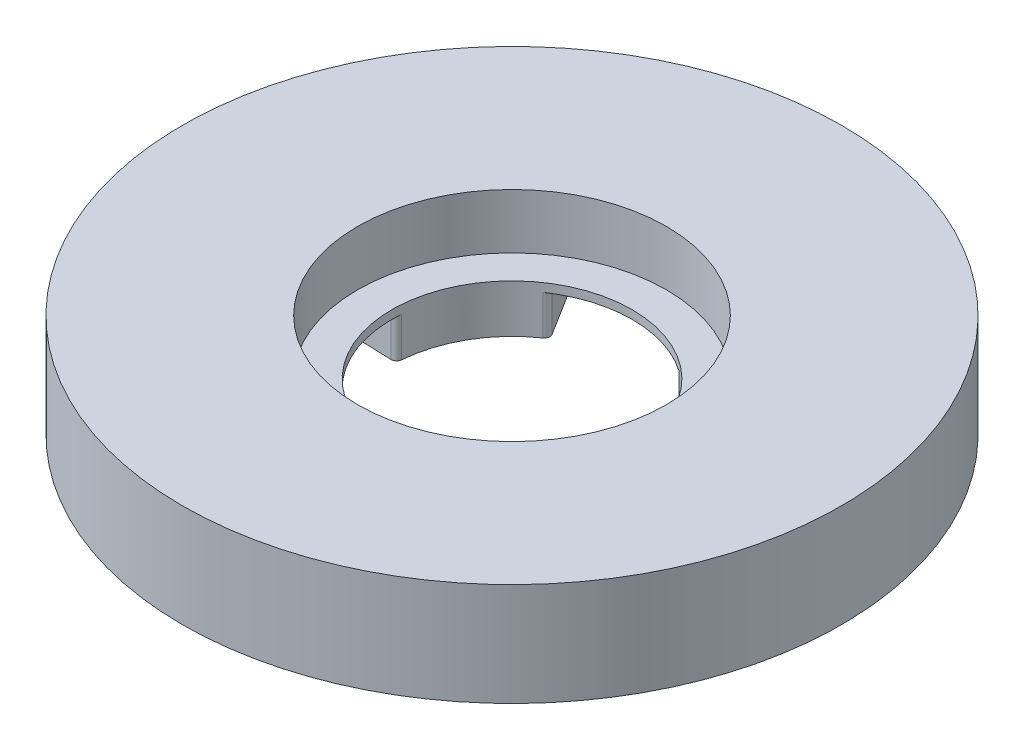
ISO-10303-21;
HEADER;
FILE_DESCRIPTION(('STEP AP214'),'2;1');
FILE_NAME('part.step','',(''),(''),'','','');
FILE_SCHEMA(('AUTOMOTIVE_DESIGN { 1 0 10303 214 1 1 1 1 }'));
ENDSEC;
DATA;
#1=APPLICATION_CONTEXT('core data for automotive mechanical design processes');
#2=APPLICATION_PROTOCOL_DEFINITION('international standard','automotive_design',2000,#1);
#3=PRODUCT_CONTEXT('',#1,'mechanical');
#4=PRODUCT('Part','Part','',(#3));
#5=PRODUCT_RELATED_PRODUCT_CATEGORY('part','',(#4));
#6=PRODUCT_DEFINITION_FORMATION('','',#4);
#7=PRODUCT_DEFINITION_CONTEXT('part definition',#1,'design');
#8=PRODUCT_DEFINITION('design','',#6,#7);
#9=PRODUCT_DEFINITION_SHAPE('','',#8);
#10=(LENGTH_UNIT() NAMED_UNIT(*) SI_UNIT(.MILLI.,.METRE.));
#11=(NAMED_UNIT(*) PLANE_ANGLE_UNIT() SI_UNIT($,.RADIAN.));
#12=(NAMED_UNIT(*) SI_UNIT($,.STERADIAN.) SOLID_ANGLE_UNIT());
#13=UNCERTAINTY_MEASURE_WITH_UNIT(LENGTH_MEASURE(1.E-05),#10,'distance_accuracy_value','');
#14=(GEOMETRIC_REPRESENTATION_CONTEXT(3) GLOBAL_UNCERTAINTY_ASSIGNED_CONTEXT((#13)) GLOBAL_UNIT_ASSIGNED_CONTEXT((#10,
#11,#12)) REPRESENTATION_CONTEXT('',''));
#15=CARTESIAN_POINT('',(0.,0.,0.));
#16=DIRECTION('',(0.,0.,1.));
#17=DIRECTION('',(1.,0.,0.));
#18=AXIS2_PLACEMENT_3D('',#15,#16,#17);
#19=CARTESIAN_POINT('',(-17.236281767268,-9.525,-1.11021387099341));
#20=DIRECTION('',(0.,-1.,0.));
#21=DIRECTION('',(0.,0.,-1.));
#22=AXIS2_PLACEMENT_3D('',#19,#20,#21);
#23=CYLINDRICAL_SURFACE('',#22,0.508);
#24=CARTESIAN_POINT('',(-17.236281767268,-5.8674,-1.11021387099341));
#25=DIRECTION('',(0.,-1.,0.));
#26=DIRECTION('',(0.,0.,-1.));
#27=AXIS2_PLACEMENT_3D('',#24,#25,#26);
#28=CIRCLE('',#27,0.508);
#29=CARTESIAN_POINT('',(-17.2540107115929,-5.8674,-0.602523330867708));
#30=VERTEX_POINT('',#29);
#31=CARTESIAN_POINT('',(-17.7432312310112,-5.8674,-1.1428672201403));
#32=VERTEX_POINT('',#31);
#33=EDGE_CURVE('E168',#30,#32,#28,.T.);
#34=ORIENTED_EDGE('',*,*,#33,.T.);
#35=DIRECTION('',(0.,-1.,0.));
#36=VECTOR('',#35,1.);
#37=CARTESIAN_POINT('',(-17.7432312310112,-9.525,-1.14286722014029));
#38=LINE('',#37,#36);
#39=CARTESIAN_POINT('',(-17.7432312310112,-9.525,-1.1428672201403));
#40=VERTEX_POINT('',#39);
#41=EDGE_CURVE('E166',#40,#32,#38,.F.);
#42=ORIENTED_EDGE('',*,*,#41,.F.);
#43=CARTESIAN_POINT('',(-17.236281767268,-9.525,-1.11021387099341));
#44=DIRECTION('',(0.,-1.,0.));
#45=DIRECTION('',(0.,0.,-1.));
#46=AXIS2_PLACEMENT_3D('',#43,#44,#45);
#47=CIRCLE('',#46,0.508);
#48=CARTESIAN_POINT('',(-17.2540107115929,-9.525,-0.602523330867708));
#49=VERTEX_POINT('',#48);
#50=EDGE_CURVE('E20',#40,#49,#47,.F.);
#51=ORIENTED_EDGE('',*,*,#50,.T.);
#52=DIRECTION('',(0.,1.,0.));
#53=VECTOR('',#52,1.);
#54=CARTESIAN_POINT('',(-17.2540107115929,-9.525,-0.602523330867708));
#55=LINE('',#54,#53);
#56=EDGE_CURVE('E163',#30,#49,#55,.F.);
#57=ORIENTED_EDGE('',*,*,#56,.F.);
#58=EDGE_LOOP('',(#34,#42,#51,#57));
#59=FACE_BOUND('',#58,.T.);
#60=ADVANCED_FACE('F17',(#59),#23,.T.);
#61=CARTESIAN_POINT('',(-9.5796142995477,-9.525,-14.3719509417433));
#62=DIRECTION('',(0.,-1.,0.));
#63=DIRECTION('',(0.,0.,-1.));
#64=AXIS2_PLACEMENT_3D('',#61,#62,#63);
#65=CYLINDRICAL_SURFACE('',#64,0.508);
#66=CARTESIAN_POINT('',(-9.5796142995477,-5.8674,-14.3719509417433));
#67=DIRECTION('',(0.,-1.,0.));
#68=DIRECTION('',(0.,0.,-1.));
#69=AXIS2_PLACEMENT_3D('',#66,#67,#68);
#70=CIRCLE('',#69,0.508);
#71=CARTESIAN_POINT('',(-9.86136766129909,-5.8674,-14.7946553812064));
#72=VERTEX_POINT('',#71);
#73=CARTESIAN_POINT('',(-9.14880586670024,-5.8674,-14.6411499279738));
#74=VERTEX_POINT('',#73);
#75=EDGE_CURVE('E359',#72,#74,#70,.T.);
#76=ORIENTED_EDGE('',*,*,#75,.T.);
#77=DIRECTION('',(0.,1.,0.));
#78=VECTOR('',#77,1.);
#79=CARTESIAN_POINT('',(-9.14880586670027,-9.525,-14.6411499279738));
#80=LINE('',#79,#78);
#81=CARTESIAN_POINT('',(-9.14880586670024,-9.525,-14.6411499279738));
#82=VERTEX_POINT('',#81);
#83=EDGE_CURVE('E258',#82,#74,#80,.T.);
#84=ORIENTED_EDGE('',*,*,#83,.F.);
#85=CARTESIAN_POINT('',(-9.5796142995477,-9.525,-14.3719509417433));
#86=DIRECTION('',(0.,-1.,0.));
#87=DIRECTION('',(0.,0.,-1.));
#88=AXIS2_PLACEMENT_3D('',#85,#86,#87);
#89=CIRCLE('',#88,0.508);
#90=CARTESIAN_POINT('',(-9.86136766129909,-9.525,-14.7946553812064));
#91=VERTEX_POINT('',#90);
#92=EDGE_CURVE('E361',#82,#91,#89,.F.);
#93=ORIENTED_EDGE('',*,*,#92,.T.);
#94=DIRECTION('',(0.,-1.,0.));
#95=VECTOR('',#94,1.);
#96=CARTESIAN_POINT('',(-9.86136766129908,-9.525,-14.7946553812064));
#97=LINE('',#96,#95);
#98=EDGE_CURVE('E175',#72,#91,#97,.T.);
#99=ORIENTED_EDGE('',*,*,#98,.F.);
#100=EDGE_LOOP('',(#76,#84,#93,#99));
#101=FACE_BOUND('',#100,.T.);
#102=ADVANCED_FACE('F374',(#101),#65,.T.);
#103=CARTESIAN_POINT('',(9.57961429954766,-9.525,-14.3719509417432));
#104=DIRECTION('',(0.,-1.,0.));
#105=DIRECTION('',(0.,0.,-1.));
#106=AXIS2_PLACEMENT_3D('',#103,#104,#105);
#107=CYLINDRICAL_SURFACE('',#106,0.508);
#108=CARTESIAN_POINT('',(9.57961429954766,-5.8674,-14.3719509417432));
#109=DIRECTION('',(0.,-1.,0.));
#110=DIRECTION('',(0.,0.,-1.));
#111=AXIS2_PLACEMENT_3D('',#108,#109,#110);
#112=CIRCLE('',#111,0.508);
#113=CARTESIAN_POINT('',(9.1488058667002,-5.8674,-14.6411499279736));
#114=VERTEX_POINT('',#113);
#115=CARTESIAN_POINT('',(9.86136766129907,-5.8674,-14.7946553812062));
#116=VERTEX_POINT('',#115);
#117=EDGE_CURVE('E355',#114,#116,#112,.T.);
#118=ORIENTED_EDGE('',*,*,#117,.T.);
#119=DIRECTION('',(0.,-1.,0.));
#120=VECTOR('',#119,1.);
#121=CARTESIAN_POINT('',(9.86136766129907,-9.525,-14.7946553812062));
#122=LINE('',#121,#120);
#123=CARTESIAN_POINT('',(9.86136766129907,-9.525,-14.7946553812062));
#124=VERTEX_POINT('',#123);
#125=EDGE_CURVE('E249',#124,#116,#122,.F.);
#126=ORIENTED_EDGE('',*,*,#125,.F.);
#127=CARTESIAN_POINT('',(9.57961429954766,-9.525,-14.3719509417432));
#128=DIRECTION('',(0.,-1.,0.));
#129=DIRECTION('',(0.,0.,-1.));
#130=AXIS2_PLACEMENT_3D('',#127,#128,#129);
#131=CIRCLE('',#130,0.508);
#132=CARTESIAN_POINT('',(9.1488058667002,-9.525,-14.6411499279736));
#133=VERTEX_POINT('',#132);
#134=EDGE_CURVE('E357',#124,#133,#131,.F.);
#135=ORIENTED_EDGE('',*,*,#134,.T.);
#136=DIRECTION('',(0.,1.,0.));
#137=VECTOR('',#136,1.);
#138=CARTESIAN_POINT('',(9.14880586670018,-9.525,-14.6411499279736));
#139=LINE('',#138,#137);
#140=EDGE_CURVE('E255',#114,#133,#139,.F.);
#141=ORIENTED_EDGE('',*,*,#140,.F.);
#142=EDGE_LOOP('',(#118,#126,#135,#141));
#143=FACE_BOUND('',#142,.T.);
#144=ADVANCED_FACE('F651',(#143),#107,.T.);
#145=CARTESIAN_POINT('',(17.2362817672678,-9.525,-1.11021387099337));
#146=DIRECTION('',(0.,-1.,0.));
#147=DIRECTION('',(0.,0.,-1.));
#148=AXIS2_PLACEMENT_3D('',#145,#146,#147);
#149=CYLINDRICAL_SURFACE('',#148,0.508);
#150=CARTESIAN_POINT('',(17.2362817672678,-5.8674,-1.11021387099337));
#151=DIRECTION('',(0.,-1.,0.));
#152=DIRECTION('',(0.,0.,-1.));
#153=AXIS2_PLACEMENT_3D('',#150,#151,#152);
#154=CIRCLE('',#153,0.508);
#155=CARTESIAN_POINT('',(17.743231231011,-5.8674,-1.14286722014026));
#156=VERTEX_POINT('',#155);
#157=CARTESIAN_POINT('',(17.2540107115926,-5.8674,-0.602523330867671));
#158=VERTEX_POINT('',#157);
#159=EDGE_CURVE('E351',#156,#158,#154,.T.);
#160=ORIENTED_EDGE('',*,*,#159,.T.);
#161=DIRECTION('',(0.,1.,0.));
#162=VECTOR('',#161,1.);
#163=CARTESIAN_POINT('',(17.2540107115926,-9.525,-0.602523330867669));
#164=LINE('',#163,#162);
#165=CARTESIAN_POINT('',(17.2540107115926,-9.525,-0.602523330867671));
#166=VERTEX_POINT('',#165);
#167=EDGE_CURVE('E241',#166,#158,#164,.T.);
#168=ORIENTED_EDGE('',*,*,#167,.F.);
#169=CARTESIAN_POINT('',(17.2362817672678,-9.525,-1.11021387099337));
#170=DIRECTION('',(0.,-1.,0.));
#171=DIRECTION('',(0.,0.,-1.));
#172=AXIS2_PLACEMENT_3D('',#169,#170,#171);
#173=CIRCLE('',#172,0.508);
#174=CARTESIAN_POINT('',(17.743231231011,-9.525,-1.14286722014026));
#175=VERTEX_POINT('',#174);
#176=EDGE_CURVE('E353',#166,#175,#173,.F.);
#177=ORIENTED_EDGE('',*,*,#176,.T.);
#178=DIRECTION('',(0.,-1.,0.));
#179=VECTOR('',#178,1.);
#180=CARTESIAN_POINT('',(17.743231231011,-9.525,-1.14286722014026));
#181=LINE('',#180,#179);
#182=EDGE_CURVE('E252',#156,#175,#181,.T.);
#183=ORIENTED_EDGE('',*,*,#182,.F.);
#184=EDGE_LOOP('',(#160,#168,#177,#183));
#185=FACE_BOUND('',#184,.T.);
#186=ADVANCED_FACE('F643',(#185),#149,.T.);
#187=CARTESIAN_POINT('',(7.65666746772007,-9.525,15.4821648127381));
#188=DIRECTION('',(0.,-1.,0.));
#189=DIRECTION('',(0.,0.,-1.));
#190=AXIS2_PLACEMENT_3D('',#187,#188,#189);
#191=CYLINDRICAL_SURFACE('',#190,0.508);
#192=CARTESIAN_POINT('',(7.65666746772007,-5.8674,15.4821648127381));
#193=DIRECTION('',(0.,-1.,0.));
#194=DIRECTION('',(0.,0.,-1.));
#195=AXIS2_PLACEMENT_3D('',#192,#193,#194);
#196=CIRCLE('',#195,0.508);
#197=CARTESIAN_POINT('',(8.10520484489241,-5.8674,15.2436732588428));
#198=VERTEX_POINT('',#197);
#199=CARTESIAN_POINT('',(7.88186356971184,-5.8674,15.937522601348));
#200=VERTEX_POINT('',#199);
#201=EDGE_CURVE('E347',#198,#200,#196,.T.);
#202=ORIENTED_EDGE('',*,*,#201,.T.);
#203=DIRECTION('',(0.,-1.,0.));
#204=VECTOR('',#203,1.);
#205=CARTESIAN_POINT('',(7.88186356971184,-9.525,15.937522601348));
#206=LINE('',#205,#204);
#207=CARTESIAN_POINT('',(7.88186356971184,-9.525,15.937522601348));
#208=VERTEX_POINT('',#207);
#209=EDGE_CURVE('E232',#208,#200,#206,.F.);
#210=ORIENTED_EDGE('',*,*,#209,.F.);
#211=CARTESIAN_POINT('',(7.65666746772007,-9.525,15.4821648127381));
#212=DIRECTION('',(0.,-1.,0.));
#213=DIRECTION('',(0.,0.,-1.));
#214=AXIS2_PLACEMENT_3D('',#211,#212,#213);
#215=CIRCLE('',#214,0.508);
#216=CARTESIAN_POINT('',(8.10520484489241,-9.525,15.2436732588428));
#217=VERTEX_POINT('',#216);
#218=EDGE_CURVE('E349',#208,#217,#215,.F.);
#219=ORIENTED_EDGE('',*,*,#218,.T.);
#220=DIRECTION('',(0.,1.,0.));
#221=VECTOR('',#220,1.);
#222=CARTESIAN_POINT('',(8.10520484489238,-9.525,15.2436732588428));
#223=LINE('',#222,#221);
#224=EDGE_CURVE('E238',#198,#217,#223,.F.);
#225=ORIENTED_EDGE('',*,*,#224,.F.);
#226=EDGE_LOOP('',(#202,#210,#219,#225));
#227=FACE_BOUND('',#226,.T.);
#228=ADVANCED_FACE('F635',(#227),#191,.T.);
#229=CARTESIAN_POINT('',(-7.65666746772029,-9.525,15.4821648127381));
#230=DIRECTION('',(0.,-1.,0.));
#231=DIRECTION('',(0.,0.,-1.));
#232=AXIS2_PLACEMENT_3D('',#229,#230,#231);
#233=CYLINDRICAL_SURFACE('',#232,0.508);
#234=CARTESIAN_POINT('',(-7.65666746772029,-5.8674,15.4821648127381));
#235=DIRECTION('',(0.,-1.,0.));
#236=DIRECTION('',(0.,0.,-1.));
#237=AXIS2_PLACEMENT_3D('',#234,#235,#236);
#238=CIRCLE('',#237,0.508);
#239=CARTESIAN_POINT('',(-7.88186356971205,-5.8674,15.937522601348));
#240=VERTEX_POINT('',#239);
#241=CARTESIAN_POINT('',(-8.10520484489262,-5.8674,15.2436732588428));
#242=VERTEX_POINT('',#241);
#243=EDGE_CURVE('E176',#240,#242,#238,.T.);
#244=ORIENTED_EDGE('',*,*,#243,.T.);
#245=DIRECTION('',(0.,1.,0.));
#246=VECTOR('',#245,1.);
#247=CARTESIAN_POINT('',(-8.10520484489259,-9.525,15.2436732588428));
#248=LINE('',#247,#246);
#249=CARTESIAN_POINT('',(-8.10520484489262,-9.525,15.2436732588428));
#250=VERTEX_POINT('',#249);
#251=EDGE_CURVE('E229',#250,#242,#248,.T.);
#252=ORIENTED_EDGE('',*,*,#251,.F.);
#253=CARTESIAN_POINT('',(-7.65666746772029,-9.525,15.4821648127381));
#254=DIRECTION('',(0.,-1.,0.));
#255=DIRECTION('',(0.,0.,-1.));
#256=AXIS2_PLACEMENT_3D('',#253,#254,#255);
#257=CIRCLE('',#256,0.508);
#258=CARTESIAN_POINT('',(-7.88186356971205,-9.525,15.937522601348));
#259=VERTEX_POINT('',#258);
#260=EDGE_CURVE('E345',#250,#259,#257,.F.);
#261=ORIENTED_EDGE('',*,*,#260,.T.);
#262=DIRECTION('',(0.,-1.,0.));
#263=VECTOR('',#262,1.);
#264=CARTESIAN_POINT('',(-7.88186356971205,-9.525,15.937522601348));
#265=LINE('',#264,#263);
#266=EDGE_CURVE('E235',#240,#259,#265,.T.);
#267=ORIENTED_EDGE('',*,*,#266,.F.);
#268=EDGE_LOOP('',(#244,#252,#261,#267));
#269=FACE_BOUND('',#268,.T.);
#270=ADVANCED_FACE('F628',(#269),#233,.T.);
#271=CARTESIAN_POINT('',(-4.06237350715329,-9.525,-0.141861208832689));
#272=DIRECTION('',(-0.0348994967025025,0.,0.999390827019096));
#273=DIRECTION('',(0.999390827019096,0.,0.0348994967025025));
#274=AXIS2_PLACEMENT_3D('',#271,#272,#273);
#275=PLANE('',#274);
#276=DIRECTION('',(-0.999390827019096,0.,-0.0348994967025026));
#277=VECTOR('',#276,1.);
#278=CARTESIAN_POINT('',(-11.6023187374872,-5.8674,-0.405161898201593));
#279=LINE('',#278,#277);
#280=CARTESIAN_POINT('',(-11.6023187374872,-5.8674,-0.405161898201593));
#281=VERTEX_POINT('',#280);
#282=EDGE_CURVE('E174',#281,#30,#279,.T.);
#283=ORIENTED_EDGE('',*,*,#282,.T.);
#284=ORIENTED_EDGE('',*,*,#56,.T.);
#285=DIRECTION('',(-0.999390827019096,0.,-0.0348994967025026));
#286=VECTOR('',#285,1.);
#287=CARTESIAN_POINT('',(-11.6023187374872,-9.525,-0.405161898201593));
#288=LINE('',#287,#286);
#289=CARTESIAN_POINT('',(-11.6023187374872,-9.525,-0.405161898201593));
#290=VERTEX_POINT('',#289);
#291=EDGE_CURVE('E171',#290,#49,#288,.T.);
#292=ORIENTED_EDGE('',*,*,#291,.F.);
#293=DIRECTION('',(0.,-1.,0.));
#294=VECTOR('',#293,1.);
#295=CARTESIAN_POINT('',(-11.6023187374872,-5.8674,-0.405161898201594));
#296=LINE('',#295,#294);
#297=EDGE_CURVE('E267',#281,#290,#296,.T.);
#298=ORIENTED_EDGE('',*,*,#297,.F.);
#299=EDGE_LOOP('',(#283,#284,#292,#298));
#300=FACE_BOUND('',#299,.T.);
#301=ADVANCED_FACE('F170',(#300),#275,.T.);
#302=CARTESIAN_POINT('',(-1.14491749414469E-13,-9.525,9.58434720477186E-13));
#303=DIRECTION('',(0.,-1.,0.));
#304=DIRECTION('',(0.,0.,-1.));
#305=AXIS2_PLACEMENT_3D('',#302,#303,#304);
#306=CYLINDRICAL_SURFACE('',#305,17.78);
#307=CARTESIAN_POINT('',(-1.14491749414469E-13,-9.525,9.58434720477186E-13));
#308=DIRECTION('',(0.,-1.,0.));
#309=DIRECTION('',(0.,0.,-1.));
#310=AXIS2_PLACEMENT_3D('',#307,#308,#309);
#311=CIRCLE('',#310,17.78);
#312=EDGE_CURVE('E182',#40,#91,#311,.T.);
#313=ORIENTED_EDGE('',*,*,#312,.F.);
#314=ORIENTED_EDGE('',*,*,#41,.T.);
#315=CARTESIAN_POINT('',(-1.14491749414469E-13,-5.8674,9.58434720477186E-13));
#316=DIRECTION('',(0.,-1.,0.));
#317=DIRECTION('',(0.,0.,-1.));
#318=AXIS2_PLACEMENT_3D('',#315,#316,#317);
#319=CIRCLE('',#318,17.78);
#320=EDGE_CURVE('E324',#32,#72,#319,.T.);
#321=ORIENTED_EDGE('',*,*,#320,.T.);
#322=ORIENTED_EDGE('',*,*,#98,.T.);
#323=EDGE_LOOP('',(#313,#314,#321,#322));
#324=FACE_BOUND('',#323,.T.);
#325=ADVANCED_FACE('F365',(#324),#306,.T.);
#326=CARTESIAN_POINT('',(-9.42196451806597,-9.525,-15.0782951496606));
#327=DIRECTION('',(0.848048096156427,0.,-0.529919264233204));
#328=DIRECTION('',(-0.529919264233204,0.,-0.848048096156427));
#329=AXIS2_PLACEMENT_3D('',#326,#327,#328);
#330=PLANE('',#329);
#331=DIRECTION('',(0.5299192642332,0.,0.848048096156429));
#332=VECTOR('',#331,1.);
#333=CARTESIAN_POINT('',(-9.14880586670023,-9.525,-14.6411499279738));
#334=LINE('',#333,#332);
#335=CARTESIAN_POINT('',(-6.15203986523166,-9.525,-9.8453218203673));
#336=VERTEX_POINT('',#335);
#337=EDGE_CURVE('E185',#82,#336,#334,.T.);
#338=ORIENTED_EDGE('',*,*,#337,.F.);
#339=ORIENTED_EDGE('',*,*,#83,.T.);
#340=DIRECTION('',(0.5299192642332,0.,0.848048096156429));
#341=VECTOR('',#340,1.);
#342=CARTESIAN_POINT('',(-9.14880586670023,-5.8674,-14.6411499279738));
#343=LINE('',#342,#341);
#344=CARTESIAN_POINT('',(-6.15203986523166,-5.8674,-9.8453218203673));
#345=VERTEX_POINT('',#344);
#346=EDGE_CURVE('E323',#74,#345,#343,.T.);
#347=ORIENTED_EDGE('',*,*,#346,.T.);
#348=DIRECTION('',(0.,-1.,0.));
#349=VECTOR('',#348,1.);
#350=CARTESIAN_POINT('',(-6.15203986523166,-5.8674,-9.8453218203673));
#351=LINE('',#350,#349);
#352=EDGE_CURVE('E183',#336,#345,#351,.F.);
#353=ORIENTED_EDGE('',*,*,#352,.F.);
#354=EDGE_LOOP('',(#338,#339,#347,#353));
#355=FACE_BOUND('',#354,.T.);
#356=ADVANCED_FACE('F377',(#355),#330,.T.);
#357=CARTESIAN_POINT('',(2.15404216423733,-9.525,-3.4471880524393));
#358=DIRECTION('',(-0.848048096156426,0.,-0.529919264233205));
#359=DIRECTION('',(-0.529919264233205,0.,0.848048096156426));
#360=AXIS2_PLACEMENT_3D('',#357,#358,#359);
#361=PLANE('',#360);
#362=DIRECTION('',(0.529919264233207,0.,-0.848048096156425));
#363=VECTOR('',#362,1.);
#364=CARTESIAN_POINT('',(6.15203986523168,-5.8674,-9.84532182036729));
#365=LINE('',#364,#363);
#366=CARTESIAN_POINT('',(6.15203986523168,-5.8674,-9.84532182036729));
#367=VERTEX_POINT('',#366);
#368=EDGE_CURVE('E316',#367,#114,#365,.T.);
#369=ORIENTED_EDGE('',*,*,#368,.T.);
#370=ORIENTED_EDGE('',*,*,#140,.T.);
#371=DIRECTION('',(0.529919264233207,0.,-0.848048096156425));
#372=VECTOR('',#371,1.);
#373=CARTESIAN_POINT('',(6.15203986523168,-9.525,-9.84532182036729));
#374=LINE('',#373,#372);
#375=CARTESIAN_POINT('',(6.15203986523168,-9.525,-9.84532182036729));
#376=VERTEX_POINT('',#375);
#377=EDGE_CURVE('E201',#376,#133,#374,.T.);
#378=ORIENTED_EDGE('',*,*,#377,.F.);
#379=DIRECTION('',(0.,-1.,0.));
#380=VECTOR('',#379,1.);
#381=CARTESIAN_POINT('',(6.15203986523168,-5.8674,-9.84532182036729));
#382=LINE('',#381,#380);
#383=EDGE_CURVE('E259',#367,#376,#382,.T.);
#384=ORIENTED_EDGE('',*,*,#383,.F.);
#385=EDGE_LOOP('',(#369,#370,#378,#384));
#386=FACE_BOUND('',#385,.T.);
#387=ADVANCED_FACE('F424',(#386),#361,.T.);
#388=CARTESIAN_POINT('',(-1.14491749414469E-13,-9.525,9.58434720477186E-13));
#389=DIRECTION('',(0.,-1.,0.));
#390=DIRECTION('',(0.,0.,-1.));
#391=AXIS2_PLACEMENT_3D('',#388,#389,#390);
#392=CYLINDRICAL_SURFACE('',#391,17.78);
#393=CARTESIAN_POINT('',(-1.14491749414469E-13,-9.525,9.58434720477186E-13));
#394=DIRECTION('',(0.,-1.,0.));
#395=DIRECTION('',(0.,0.,-1.));
#396=AXIS2_PLACEMENT_3D('',#393,#394,#395);
#397=CIRCLE('',#396,17.78);
#398=EDGE_CURVE('E204',#124,#175,#397,.T.);
#399=ORIENTED_EDGE('',*,*,#398,.F.);
#400=ORIENTED_EDGE('',*,*,#125,.T.);
#401=CARTESIAN_POINT('',(-1.14491749414469E-13,-5.8674,9.58434720477186E-13));
#402=DIRECTION('',(0.,-1.,0.));
#403=DIRECTION('',(0.,0.,-1.));
#404=AXIS2_PLACEMENT_3D('',#401,#402,#403);
#405=CIRCLE('',#404,17.78);
#406=EDGE_CURVE('E313',#116,#156,#405,.T.);
#407=ORIENTED_EDGE('',*,*,#406,.T.);
#408=ORIENTED_EDGE('',*,*,#182,.T.);
#409=EDGE_LOOP('',(#399,#400,#407,#408));
#410=FACE_BOUND('',#409,.T.);
#411=ADVANCED_FACE('F595',(#410),#392,.T.);
#412=CARTESIAN_POINT('',(17.7691689043995,-9.525,-0.620513051370464));
#413=DIRECTION('',(0.0348994967025008,0.,0.999390827019096));
#414=DIRECTION('',(0.999390827019096,0.,-0.0348994967025008));
#415=AXIS2_PLACEMENT_3D('',#412,#413,#414);
#416=PLANE('',#415);
#417=DIRECTION('',(-0.999390827019096,0.,0.0348994967025013));
#418=VECTOR('',#417,1.);
#419=CARTESIAN_POINT('',(17.2540107115926,-9.525,-0.60252333086767));
#420=LINE('',#419,#418);
#421=CARTESIAN_POINT('',(11.6023187374872,-9.525,-0.405161898201573));
#422=VERTEX_POINT('',#421);
#423=EDGE_CURVE('E206',#166,#422,#420,.T.);
#424=ORIENTED_EDGE('',*,*,#423,.F.);
#425=ORIENTED_EDGE('',*,*,#167,.T.);
#426=DIRECTION('',(-0.999390827019096,0.,0.0348994967025012));
#427=VECTOR('',#426,1.);
#428=CARTESIAN_POINT('',(17.2540107115926,-5.8674,-0.60252333086767));
#429=LINE('',#428,#427);
#430=CARTESIAN_POINT('',(11.6023187374872,-5.8674,-0.405161898201573));
#431=VERTEX_POINT('',#430);
#432=EDGE_CURVE('E312',#158,#431,#429,.T.);
#433=ORIENTED_EDGE('',*,*,#432,.T.);
#434=DIRECTION('',(0.,-1.,0.));
#435=VECTOR('',#434,1.);
#436=CARTESIAN_POINT('',(11.6023187374872,-5.8674,-0.405161898201573));
#437=LINE('',#436,#435);
#438=EDGE_CURVE('E209',#422,#431,#437,.F.);
#439=ORIENTED_EDGE('',*,*,#438,.F.);
#440=EDGE_LOOP('',(#424,#425,#433,#439));
#441=FACE_BOUND('',#440,.T.);
#442=ADVANCED_FACE('F588',(#441),#416,.T.);
#443=CARTESIAN_POINT('',(1.90833134291598,-9.525,3.58904926127198));
#444=DIRECTION('',(0.882947592858934,0.,-0.469471562785878));
#445=DIRECTION('',(-0.469471562785878,0.,-0.882947592858934));
#446=AXIS2_PLACEMENT_3D('',#443,#444,#445);
#447=PLANE('',#446);
#448=DIRECTION('',(0.46947156278588,0.,0.882947592858932));
#449=VECTOR('',#448,1.);
#450=CARTESIAN_POINT('',(5.4502788722554,-9.525,10.2504837185689));
#451=LINE('',#450,#449);
#452=CARTESIAN_POINT('',(5.4502788722554,-9.525,10.2504837185689));
#453=VERTEX_POINT('',#452);
#454=EDGE_CURVE('E217',#453,#217,#451,.T.);
#455=ORIENTED_EDGE('',*,*,#454,.F.);
#456=DIRECTION('',(0.,-1.,0.));
#457=VECTOR('',#456,1.);
#458=CARTESIAN_POINT('',(5.45027887225541,-5.8674,10.2504837185689));
#459=LINE('',#458,#457);
#460=CARTESIAN_POINT('',(5.4502788722554,-5.8674,10.2504837185689));
#461=VERTEX_POINT('',#460);
#462=EDGE_CURVE('E220',#461,#453,#459,.T.);
#463=ORIENTED_EDGE('',*,*,#462,.F.);
#464=DIRECTION('',(0.46947156278588,0.,0.882947592858932));
#465=VECTOR('',#464,1.);
#466=CARTESIAN_POINT('',(5.4502788722554,-5.8674,10.2504837185689));
#467=LINE('',#466,#465);
#468=EDGE_CURVE('E305',#461,#198,#467,.T.);
#469=ORIENTED_EDGE('',*,*,#468,.T.);
#470=ORIENTED_EDGE('',*,*,#224,.T.);
#471=EDGE_LOOP('',(#455,#463,#469,#470));
#472=FACE_BOUND('',#471,.T.);
#473=ADVANCED_FACE('F580',(#472),#447,.T.);
#474=CARTESIAN_POINT('',(-1.14491749414469E-13,-9.525,9.58434720477186E-13));
#475=DIRECTION('',(0.,-1.,0.));
#476=DIRECTION('',(0.,0.,-1.));
#477=AXIS2_PLACEMENT_3D('',#474,#475,#476);
#478=CYLINDRICAL_SURFACE('',#477,17.78);
#479=CARTESIAN_POINT('',(-1.14491749414469E-13,-9.525,9.58434720477186E-13));
#480=DIRECTION('',(0.,-1.,0.));
#481=DIRECTION('',(0.,0.,-1.));
#482=AXIS2_PLACEMENT_3D('',#479,#480,#481);
#483=CIRCLE('',#482,17.78);
#484=EDGE_CURVE('E225',#208,#259,#483,.T.);
#485=ORIENTED_EDGE('',*,*,#484,.F.);
#486=ORIENTED_EDGE('',*,*,#209,.T.);
#487=CARTESIAN_POINT('',(-1.14491749414469E-13,-5.8674,9.58434720477186E-13));
#488=DIRECTION('',(0.,-1.,0.));
#489=DIRECTION('',(0.,0.,-1.));
#490=AXIS2_PLACEMENT_3D('',#487,#488,#489);
#491=CIRCLE('',#490,17.78);
#492=EDGE_CURVE('E302',#200,#240,#491,.T.);
#493=ORIENTED_EDGE('',*,*,#492,.T.);
#494=ORIENTED_EDGE('',*,*,#266,.T.);
#495=EDGE_LOOP('',(#485,#486,#493,#494));
#496=FACE_BOUND('',#495,.T.);
#497=ADVANCED_FACE('F573',(#496),#478,.T.);
#498=CARTESIAN_POINT('',(-1.90833134291597,-9.525,3.58904926127198));
#499=DIRECTION('',(-0.882947592858927,0.,-0.469471562785891));
#500=DIRECTION('',(-0.469471562785891,0.,0.882947592858927));
#501=AXIS2_PLACEMENT_3D('',#498,#499,#500);
#502=PLANE('',#501);
#503=DIRECTION('',(0.469471562785897,0.,-0.882947592858924));
#504=VECTOR('',#503,1.);
#505=CARTESIAN_POINT('',(-8.10520484489262,-5.8674,15.2436732588428));
#506=LINE('',#505,#504);
#507=CARTESIAN_POINT('',(-5.4502788722555,-5.8674,10.2504837185689));
#508=VERTEX_POINT('',#507);
#509=EDGE_CURVE('E301',#242,#508,#506,.T.);
#510=ORIENTED_EDGE('',*,*,#509,.T.);
#511=DIRECTION('',(0.,-1.,0.));
#512=VECTOR('',#511,1.);
#513=CARTESIAN_POINT('',(-5.45027887225551,-5.8674,10.2504837185689));
#514=LINE('',#513,#512);
#515=CARTESIAN_POINT('',(-5.4502788722555,-9.525,10.2504837185689));
#516=VERTEX_POINT('',#515);
#517=EDGE_CURVE('E226',#516,#508,#514,.F.);
#518=ORIENTED_EDGE('',*,*,#517,.F.);
#519=DIRECTION('',(0.469471562785897,0.,-0.882947592858924));
#520=VECTOR('',#519,1.);
#521=CARTESIAN_POINT('',(-8.10520484489262,-9.525,15.2436732588428));
#522=LINE('',#521,#520);
#523=EDGE_CURVE('E222',#250,#516,#522,.T.);
#524=ORIENTED_EDGE('',*,*,#523,.F.);
#525=ORIENTED_EDGE('',*,*,#251,.T.);
#526=EDGE_LOOP('',(#510,#518,#524,#525));
#527=FACE_BOUND('',#526,.T.);
#528=ADVANCED_FACE('F437',(#527),#502,.T.);
#529=CARTESIAN_POINT('',(-5.00174149508316,-5.8674,10.4889752724641));
#530=DIRECTION('',(0.,-1.,0.));
#531=DIRECTION('',(0.,0.,-1.));
#532=AXIS2_PLACEMENT_3D('',#529,#530,#531);
#533=CYLINDRICAL_SURFACE('',#532,0.508);
#534=CARTESIAN_POINT('',(-5.00174149508316,-5.8674,10.4889752724641));
#535=DIRECTION('',(0.,-1.,0.));
#536=DIRECTION('',(0.,0.,-1.));
#537=AXIS2_PLACEMENT_3D('',#534,#535,#536);
#538=CIRCLE('',#537,0.508);
#539=CARTESIAN_POINT('',(-4.78308612917788,-5.8674,10.0304408343236));
#540=VERTEX_POINT('',#539);
#541=EDGE_CURVE('E298',#508,#540,#538,.T.);
#542=ORIENTED_EDGE('',*,*,#541,.T.);
#543=DIRECTION('',(0.,-1.,0.));
#544=VECTOR('',#543,1.);
#545=CARTESIAN_POINT('',(-4.78308612917788,-5.8674,10.0304408343236));
#546=LINE('',#545,#544);
#547=CARTESIAN_POINT('',(-4.78308612917788,-9.525,10.0304408343236));
#548=VERTEX_POINT('',#547);
#549=EDGE_CURVE('E297',#540,#548,#546,.T.);
#550=ORIENTED_EDGE('',*,*,#549,.T.);
#551=CARTESIAN_POINT('',(-5.00174149508316,-9.525,10.4889752724641));
#552=DIRECTION('',(0.,-1.,0.));
#553=DIRECTION('',(0.,0.,-1.));
#554=AXIS2_PLACEMENT_3D('',#551,#552,#553);
#555=CIRCLE('',#554,0.508);
#556=EDGE_CURVE('E221',#516,#548,#555,.T.);
#557=ORIENTED_EDGE('',*,*,#556,.F.);
#558=ORIENTED_EDGE('',*,*,#517,.T.);
#559=EDGE_LOOP('',(#542,#550,#557,#558));
#560=FACE_BOUND('',#559,.T.);
#561=ADVANCED_FACE('F394',(#560),#533,.T.);
#562=CARTESIAN_POINT('',(-4.15101822877765,-9.525,2.39659149179581));
#563=DIRECTION('',(0.,-1.,0.));
#564=DIRECTION('',(0.,0.,-1.));
#565=AXIS2_PLACEMENT_3D('',#562,#563,#564);
#566=PLANE('',#565);
#567=ORIENTED_EDGE('',*,*,#454,.T.);
#568=ORIENTED_EDGE('',*,*,#218,.F.);
#569=ORIENTED_EDGE('',*,*,#484,.T.);
#570=ORIENTED_EDGE('',*,*,#260,.F.);
#571=ORIENTED_EDGE('',*,*,#523,.T.);
#572=ORIENTED_EDGE('',*,*,#556,.T.);
#573=CARTESIAN_POINT('',(0.,-9.525,0.));
#574=DIRECTION('',(0.,-1.,0.));
#575=DIRECTION('',(0.,0.,-1.));
#576=AXIS2_PLACEMENT_3D('',#573,#574,#575);
#577=CIRCLE('',#576,11.1125);
#578=CARTESIAN_POINT('',(4.78308612917781,-9.525,10.0304408343236));
#579=VERTEX_POINT('',#578);
#580=EDGE_CURVE('E216',#548,#579,#577,.F.);
#581=ORIENTED_EDGE('',*,*,#580,.T.);
#582=CARTESIAN_POINT('',(5.00174149508306,-9.525,10.4889752724641));
#583=DIRECTION('',(0.,-1.,0.));
#584=DIRECTION('',(0.,0.,-1.));
#585=AXIS2_PLACEMENT_3D('',#582,#583,#584);
#586=CIRCLE('',#585,0.508);
#587=EDGE_CURVE('E244',#453,#579,#586,.F.);
#588=ORIENTED_EDGE('',*,*,#587,.F.);
#589=EDGE_LOOP('',(#567,#568,#569,#570,#571,#572,#581,#588));
#590=FACE_BOUND('',#589,.T.);
#591=ADVANCED_FACE('F397',(#590),#566,.T.);
#592=CARTESIAN_POINT('',(5.00174149508306,-5.8674,10.4889752724641));
#593=DIRECTION('',(0.,-1.,0.));
#594=DIRECTION('',(0.,0.,-1.));
#595=AXIS2_PLACEMENT_3D('',#592,#593,#594);
#596=CYLINDRICAL_SURFACE('',#595,0.508);
#597=ORIENTED_EDGE('',*,*,#587,.T.);
#598=DIRECTION('',(0.,-1.,0.));
#599=VECTOR('',#598,1.);
#600=CARTESIAN_POINT('',(4.7830861291778,-5.8674,10.0304408343236));
#601=LINE('',#600,#599);
#602=CARTESIAN_POINT('',(4.7830861291778,-5.8674,10.0304408343236));
#603=VERTEX_POINT('',#602);
#604=EDGE_CURVE('E213',#579,#603,#601,.F.);
#605=ORIENTED_EDGE('',*,*,#604,.T.);
#606=CARTESIAN_POINT('',(5.00174149508306,-5.8674,10.4889752724641));
#607=DIRECTION('',(0.,-1.,0.));
#608=DIRECTION('',(0.,0.,-1.));
#609=AXIS2_PLACEMENT_3D('',#606,#607,#608);
#610=CIRCLE('',#609,0.508);
#611=EDGE_CURVE('E306',#603,#461,#610,.T.);
#612=ORIENTED_EDGE('',*,*,#611,.T.);
#613=ORIENTED_EDGE('',*,*,#462,.T.);
#614=EDGE_LOOP('',(#597,#605,#612,#613));
#615=FACE_BOUND('',#614,.T.);
#616=ADVANCED_FACE('F405',(#615),#596,.T.);
#617=CARTESIAN_POINT('',(11.5845897931623,-5.8674,-0.912852438327273));
#618=DIRECTION('',(0.,-1.,0.));
#619=DIRECTION('',(0.,0.,-1.));
#620=AXIS2_PLACEMENT_3D('',#617,#618,#619);
#621=CYLINDRICAL_SURFACE('',#620,0.508);
#622=CARTESIAN_POINT('',(11.5845897931623,-5.8674,-0.912852438327273));
#623=DIRECTION('',(0.,-1.,0.));
#624=DIRECTION('',(0.,0.,-1.));
#625=AXIS2_PLACEMENT_3D('',#622,#623,#624);
#626=CIRCLE('',#625,0.508);
#627=CARTESIAN_POINT('',(11.07815963827,-5.8674,-0.872946320804772));
#628=VERTEX_POINT('',#627);
#629=EDGE_CURVE('E309',#431,#628,#626,.T.);
#630=ORIENTED_EDGE('',*,*,#629,.T.);
#631=DIRECTION('',(0.,-1.,0.));
#632=VECTOR('',#631,1.);
#633=CARTESIAN_POINT('',(11.07815963827,-5.8674,-0.872946320804774));
#634=LINE('',#633,#632);
#635=CARTESIAN_POINT('',(11.07815963827,-9.525,-0.872946320804772));
#636=VERTEX_POINT('',#635);
#637=EDGE_CURVE('E210',#628,#636,#634,.T.);
#638=ORIENTED_EDGE('',*,*,#637,.T.);
#639=CARTESIAN_POINT('',(11.5845897931623,-9.525,-0.912852438327273));
#640=DIRECTION('',(0.,-1.,0.));
#641=DIRECTION('',(0.,0.,-1.));
#642=AXIS2_PLACEMENT_3D('',#639,#640,#641);
#643=CIRCLE('',#642,0.508);
#644=EDGE_CURVE('E205',#422,#636,#643,.T.);
#645=ORIENTED_EDGE('',*,*,#644,.F.);
#646=ORIENTED_EDGE('',*,*,#438,.T.);
#647=EDGE_LOOP('',(#630,#638,#645,#646));
#648=FACE_BOUND('',#647,.T.);
#649=ADVANCED_FACE('F540',(#648),#621,.T.);
#650=CARTESIAN_POINT('',(-4.15101822877765,-9.525,2.39659149179581));
#651=DIRECTION('',(0.,-1.,0.));
#652=DIRECTION('',(0.,0.,-1.));
#653=AXIS2_PLACEMENT_3D('',#650,#651,#652);
#654=PLANE('',#653);
#655=ORIENTED_EDGE('',*,*,#398,.T.);
#656=ORIENTED_EDGE('',*,*,#176,.F.);
#657=ORIENTED_EDGE('',*,*,#423,.T.);
#658=ORIENTED_EDGE('',*,*,#644,.T.);
#659=CARTESIAN_POINT('',(0.,-9.525,0.));
#660=DIRECTION('',(0.,-1.,0.));
#661=DIRECTION('',(0.,0.,-1.));
#662=AXIS2_PLACEMENT_3D('',#659,#660,#661);
#663=CIRCLE('',#662,11.1125);
#664=CARTESIAN_POINT('',(6.29507350909207,-9.525,-9.15749451351882));
#665=VERTEX_POINT('',#664);
#666=EDGE_CURVE('E200',#636,#665,#663,.F.);
#667=ORIENTED_EDGE('',*,*,#666,.T.);
#668=CARTESIAN_POINT('',(6.58284829807914,-9.525,-9.57612283413682));
#669=DIRECTION('',(0.,-1.,0.));
#670=DIRECTION('',(0.,0.,-1.));
#671=AXIS2_PLACEMENT_3D('',#668,#669,#670);
#672=CIRCLE('',#671,0.508);
#673=EDGE_CURVE('E188',#376,#665,#672,.F.);
#674=ORIENTED_EDGE('',*,*,#673,.F.);
#675=ORIENTED_EDGE('',*,*,#377,.T.);
#676=ORIENTED_EDGE('',*,*,#134,.F.);
#677=EDGE_LOOP('',(#655,#656,#657,#658,#667,#674,#675,#676));
#678=FACE_BOUND('',#677,.T.);
#679=ADVANCED_FACE('F532',(#678),#654,.T.);
#680=CARTESIAN_POINT('',(6.58284829807914,-5.8674,-9.57612283413682));
#681=DIRECTION('',(0.,-1.,0.));
#682=DIRECTION('',(0.,0.,-1.));
#683=AXIS2_PLACEMENT_3D('',#680,#681,#682);
#684=CYLINDRICAL_SURFACE('',#683,0.508);
#685=ORIENTED_EDGE('',*,*,#673,.T.);
#686=DIRECTION('',(0.,-1.,0.));
#687=VECTOR('',#686,1.);
#688=CARTESIAN_POINT('',(6.29507350909207,-5.8674,-9.15749451351882));
#689=LINE('',#688,#687);
#690=CARTESIAN_POINT('',(6.29507350909207,-5.8674,-9.15749451351882));
#691=VERTEX_POINT('',#690);
#692=EDGE_CURVE('E197',#665,#691,#689,.F.);
#693=ORIENTED_EDGE('',*,*,#692,.T.);
#694=CARTESIAN_POINT('',(6.58284829807914,-5.8674,-9.57612283413682));
#695=DIRECTION('',(0.,-1.,0.));
#696=DIRECTION('',(0.,0.,-1.));
#697=AXIS2_PLACEMENT_3D('',#694,#695,#696);
#698=CIRCLE('',#697,0.508);
#699=EDGE_CURVE('E317',#691,#367,#698,.T.);
#700=ORIENTED_EDGE('',*,*,#699,.T.);
#701=ORIENTED_EDGE('',*,*,#383,.T.);
#702=EDGE_LOOP('',(#685,#693,#700,#701));
#703=FACE_BOUND('',#702,.T.);
#704=ADVANCED_FACE('F525',(#703),#684,.T.);
#705=CARTESIAN_POINT('',(-6.58284829807912,-5.8674,-9.57612283413683));
#706=DIRECTION('',(0.,-1.,0.));
#707=DIRECTION('',(0.,0.,-1.));
#708=AXIS2_PLACEMENT_3D('',#705,#706,#707);
#709=CYLINDRICAL_SURFACE('',#708,0.508);
#710=CARTESIAN_POINT('',(-6.58284829807912,-5.8674,-9.57612283413683));
#711=DIRECTION('',(0.,-1.,0.));
#712=DIRECTION('',(0.,0.,-1.));
#713=AXIS2_PLACEMENT_3D('',#710,#711,#712);
#714=CIRCLE('',#713,0.508);
#715=CARTESIAN_POINT('',(-6.29507350909206,-5.8674,-9.15749451351883));
#716=VERTEX_POINT('',#715);
#717=EDGE_CURVE('E320',#345,#716,#714,.T.);
#718=ORIENTED_EDGE('',*,*,#717,.T.);
#719=DIRECTION('',(0.,-1.,0.));
#720=VECTOR('',#719,1.);
#721=CARTESIAN_POINT('',(-6.29507350909206,-5.8674,-9.15749451351883));
#722=LINE('',#721,#720);
#723=CARTESIAN_POINT('',(-6.29507350909206,-9.525,-9.15749451351883));
#724=VERTEX_POINT('',#723);
#725=EDGE_CURVE('E193',#716,#724,#722,.T.);
#726=ORIENTED_EDGE('',*,*,#725,.T.);
#727=CARTESIAN_POINT('',(-6.58284829807912,-9.525,-9.57612283413683));
#728=DIRECTION('',(0.,-1.,0.));
#729=DIRECTION('',(0.,0.,-1.));
#730=AXIS2_PLACEMENT_3D('',#727,#728,#729);
#731=CIRCLE('',#730,0.508);
#732=EDGE_CURVE('E268',#336,#724,#731,.T.);
#733=ORIENTED_EDGE('',*,*,#732,.F.);
#734=ORIENTED_EDGE('',*,*,#352,.T.);
#735=EDGE_LOOP('',(#718,#726,#733,#734));
#736=FACE_BOUND('',#735,.T.);
#737=ADVANCED_FACE('F380',(#736),#709,.T.);
#738=CARTESIAN_POINT('',(-4.15101822877765,-9.525,2.39659149179581));
#739=DIRECTION('',(0.,-1.,0.));
#740=DIRECTION('',(0.,0.,-1.));
#741=AXIS2_PLACEMENT_3D('',#738,#739,#740);
#742=PLANE('',#741);
#743=ORIENTED_EDGE('',*,*,#337,.T.);
#744=ORIENTED_EDGE('',*,*,#732,.T.);
#745=CARTESIAN_POINT('',(0.,-9.525,0.));
#746=DIRECTION('',(0.,-1.,0.));
#747=DIRECTION('',(0.,0.,-1.));
#748=AXIS2_PLACEMENT_3D('',#745,#746,#747);
#749=CIRCLE('',#748,11.1125);
#750=CARTESIAN_POINT('',(-11.07815963827,-9.525,-0.872946320804789));
#751=VERTEX_POINT('',#750);
#752=EDGE_CURVE('E195',#724,#751,#749,.F.);
#753=ORIENTED_EDGE('',*,*,#752,.T.);
#754=CARTESIAN_POINT('',(-11.5845897931623,-9.525,-0.912852438327294));
#755=DIRECTION('',(0.,-1.,0.));
#756=DIRECTION('',(0.,0.,-1.));
#757=AXIS2_PLACEMENT_3D('',#754,#755,#756);
#758=CIRCLE('',#757,0.508);
#759=EDGE_CURVE('E180',#290,#751,#758,.F.);
#760=ORIENTED_EDGE('',*,*,#759,.F.);
#761=ORIENTED_EDGE('',*,*,#291,.T.);
#762=ORIENTED_EDGE('',*,*,#50,.F.);
#763=ORIENTED_EDGE('',*,*,#312,.T.);
#764=ORIENTED_EDGE('',*,*,#92,.F.);
#765=EDGE_LOOP('',(#743,#744,#753,#760,#761,#762,#763,#764));
#766=FACE_BOUND('',#765,.T.);
#767=ADVANCED_FACE('F179',(#766),#742,.T.);
#768=CARTESIAN_POINT('',(-11.5845897931623,-5.8674,-0.912852438327294));
#769=DIRECTION('',(0.,-1.,0.));
#770=DIRECTION('',(0.,0.,-1.));
#771=AXIS2_PLACEMENT_3D('',#768,#769,#770);
#772=CYLINDRICAL_SURFACE('',#771,0.508);
#773=ORIENTED_EDGE('',*,*,#759,.T.);
#774=DIRECTION('',(0.,-1.,0.));
#775=VECTOR('',#774,1.);
#776=CARTESIAN_POINT('',(-11.07815963827,-5.8674,-0.872946320804788));
#777=LINE('',#776,#775);
#778=CARTESIAN_POINT('',(-11.07815963827,-5.8674,-0.872946320804789));
#779=VERTEX_POINT('',#778);
#780=EDGE_CURVE('E35',#751,#779,#777,.F.);
#781=ORIENTED_EDGE('',*,*,#780,.T.);
#782=CARTESIAN_POINT('',(-11.5845897931623,-5.8674,-0.912852438327294));
#783=DIRECTION('',(0.,-1.,0.));
#784=DIRECTION('',(0.,0.,-1.));
#785=AXIS2_PLACEMENT_3D('',#782,#783,#784);
#786=CIRCLE('',#785,0.508);
#787=EDGE_CURVE('E327',#779,#281,#786,.T.);
#788=ORIENTED_EDGE('',*,*,#787,.T.);
#789=ORIENTED_EDGE('',*,*,#297,.T.);
#790=EDGE_LOOP('',(#773,#781,#788,#789));
#791=FACE_BOUND('',#790,.T.);
#792=ADVANCED_FACE('F439',(#791),#772,.T.);
#793=CARTESIAN_POINT('',(0.,-5.8674,0.));
#794=DIRECTION('',(0.,1.,0.));
#795=DIRECTION('',(0.,0.,1.));
#796=AXIS2_PLACEMENT_3D('',#793,#794,#795);
#797=PLANE('',#796);
#798=CARTESIAN_POINT('',(0.,-5.8674,0.));
#799=DIRECTION('',(0.,-1.,0.));
#800=DIRECTION('',(0.,0.,-1.));
#801=AXIS2_PLACEMENT_3D('',#798,#799,#800);
#802=CIRCLE('',#801,26.9875);
#803=CARTESIAN_POINT('',(0.,-5.8674,-26.9875));
#804=VERTEX_POINT('',#803);
#805=EDGE_CURVE('E284',#804,#804,#802,.T.);
#806=ORIENTED_EDGE('',*,*,#805,.T.);
#807=EDGE_LOOP('',(#806));
#808=FACE_BOUND('',#807,.T.);
#809=ORIENTED_EDGE('',*,*,#541,.F.);
#810=ORIENTED_EDGE('',*,*,#509,.F.);
#811=ORIENTED_EDGE('',*,*,#243,.F.);
#812=ORIENTED_EDGE('',*,*,#492,.F.);
#813=ORIENTED_EDGE('',*,*,#201,.F.);
#814=ORIENTED_EDGE('',*,*,#468,.F.);
#815=ORIENTED_EDGE('',*,*,#611,.F.);
#816=CARTESIAN_POINT('',(0.,-5.8674,0.));
#817=DIRECTION('',(0.,-1.,0.));
#818=DIRECTION('',(0.,0.,-1.));
#819=AXIS2_PLACEMENT_3D('',#816,#817,#818);
#820=CIRCLE('',#819,11.1125);
#821=EDGE_CURVE('E212',#603,#628,#820,.F.);
#822=ORIENTED_EDGE('',*,*,#821,.T.);
#823=ORIENTED_EDGE('',*,*,#629,.F.);
#824=ORIENTED_EDGE('',*,*,#432,.F.);
#825=ORIENTED_EDGE('',*,*,#159,.F.);
#826=ORIENTED_EDGE('',*,*,#406,.F.);
#827=ORIENTED_EDGE('',*,*,#117,.F.);
#828=ORIENTED_EDGE('',*,*,#368,.F.);
#829=ORIENTED_EDGE('',*,*,#699,.F.);
#830=CARTESIAN_POINT('',(0.,-5.8674,0.));
#831=DIRECTION('',(0.,-1.,0.));
#832=DIRECTION('',(0.,0.,-1.));
#833=AXIS2_PLACEMENT_3D('',#830,#831,#832);
#834=CIRCLE('',#833,11.1125);
#835=EDGE_CURVE('E196',#691,#716,#834,.F.);
#836=ORIENTED_EDGE('',*,*,#835,.T.);
#837=ORIENTED_EDGE('',*,*,#717,.F.);
#838=ORIENTED_EDGE('',*,*,#346,.F.);
#839=ORIENTED_EDGE('',*,*,#75,.F.);
#840=ORIENTED_EDGE('',*,*,#320,.F.);
#841=ORIENTED_EDGE('',*,*,#33,.F.);
#842=ORIENTED_EDGE('',*,*,#282,.F.);
#843=ORIENTED_EDGE('',*,*,#787,.F.);
#844=CARTESIAN_POINT('',(0.,-5.8674,0.));
#845=DIRECTION('',(0.,-1.,0.));
#846=DIRECTION('',(0.,0.,-1.));
#847=AXIS2_PLACEMENT_3D('',#844,#845,#846);
#848=CIRCLE('',#847,11.1125);
#849=EDGE_CURVE('E287',#779,#540,#848,.F.);
#850=ORIENTED_EDGE('',*,*,#849,.T.);
#851=EDGE_LOOP('',(#809,#810,#811,#812,#813,#814,#815,#822,#823,#824,#825,#826,#827,#828,#829,
#836,#837,#838,#839,#840,#841,#842,#843,#850));
#852=FACE_BOUND('',#851,.T.);
#853=ADVANCED_FACE('F367',(#808,#852),#797,.F.);
#854=CARTESIAN_POINT('',(0.,-5.8674,0.));
#855=DIRECTION('',(0.,-1.,0.));
#856=DIRECTION('',(0.,0.,-1.));
#857=AXIS2_PLACEMENT_3D('',#854,#855,#856);
#858=CYLINDRICAL_SURFACE('',#857,11.1125);
#859=ORIENTED_EDGE('',*,*,#780,.F.);
#860=ORIENTED_EDGE('',*,*,#752,.F.);
#861=ORIENTED_EDGE('',*,*,#725,.F.);
#862=ORIENTED_EDGE('',*,*,#835,.F.);
#863=ORIENTED_EDGE('',*,*,#692,.F.);
#864=ORIENTED_EDGE('',*,*,#666,.F.);
#865=ORIENTED_EDGE('',*,*,#637,.F.);
#866=ORIENTED_EDGE('',*,*,#821,.F.);
#867=ORIENTED_EDGE('',*,*,#604,.F.);
#868=ORIENTED_EDGE('',*,*,#580,.F.);
#869=ORIENTED_EDGE('',*,*,#549,.F.);
#870=ORIENTED_EDGE('',*,*,#849,.F.);
#871=EDGE_LOOP('',(#859,#860,#861,#862,#863,#864,#865,#866,#867,#868,#869,#870));
#872=FACE_BOUND('',#871,.T.);
#873=CARTESIAN_POINT('',(0.,-5.08,0.));
#874=DIRECTION('',(0.,-1.,0.));
#875=DIRECTION('',(0.,0.,-1.));
#876=AXIS2_PLACEMENT_3D('',#873,#874,#875);
#877=CIRCLE('',#876,11.1125);
#878=CARTESIAN_POINT('',(0.,-5.08,-11.1125));
#879=VERTEX_POINT('',#878);
#880=EDGE_CURVE('E281',#879,#879,#877,.F.);
#881=ORIENTED_EDGE('',*,*,#880,.T.);
#882=EDGE_LOOP('',(#881));
#883=FACE_BOUND('',#882,.T.);
#884=ADVANCED_FACE('F384',(#872,#883),#858,.F.);
#885=CARTESIAN_POINT('',(0.,-9.525,0.));
#886=DIRECTION('',(0.,-1.,0.));
#887=DIRECTION('',(0.,0.,-1.));
#888=AXIS2_PLACEMENT_3D('',#885,#886,#887);
#889=CYLINDRICAL_SURFACE('',#888,26.9875);
#890=CARTESIAN_POINT('',(0.,-9.525,0.));
#891=DIRECTION('',(0.,-1.,0.));
#892=DIRECTION('',(0.,0.,-1.));
#893=AXIS2_PLACEMENT_3D('',#890,#891,#892);
#894=CIRCLE('',#893,26.9875);
#895=CARTESIAN_POINT('',(0.,-9.525,-26.9875));
#896=VERTEX_POINT('',#895);
#897=EDGE_CURVE('E278',#896,#896,#894,.T.);
#898=ORIENTED_EDGE('',*,*,#897,.T.);
#899=EDGE_LOOP('',(#898));
#900=FACE_BOUND('',#899,.T.);
#901=ORIENTED_EDGE('',*,*,#805,.F.);
#902=EDGE_LOOP('',(#901));
#903=FACE_BOUND('',#902,.T.);
#904=ADVANCED_FACE('F473',(#900,#903),#889,.F.);
#905=CARTESIAN_POINT('',(0.,-5.08,0.));
#906=DIRECTION('',(0.,-1.,0.));
#907=DIRECTION('',(0.,0.,-1.));
#908=AXIS2_PLACEMENT_3D('',#905,#906,#907);
#909=PLANE('',#908);
#910=CARTESIAN_POINT('',(0.,-5.08,0.));
#911=DIRECTION('',(0.,1.,0.));
#912=DIRECTION('',(0.,0.,1.));
#913=AXIS2_PLACEMENT_3D('',#910,#911,#912);
#914=CIRCLE('',#913,14.28115);
#915=CARTESIAN_POINT('',(0.,-5.08,14.28115));
#916=VERTEX_POINT('',#915);
#917=EDGE_CURVE('E275',#916,#916,#914,.T.);
#918=ORIENTED_EDGE('',*,*,#917,.T.);
#919=EDGE_LOOP('',(#918));
#920=FACE_BOUND('',#919,.T.);
#921=ORIENTED_EDGE('',*,*,#880,.F.);
#922=EDGE_LOOP('',(#921));
#923=FACE_BOUND('',#922,.T.);
#924=ADVANCED_FACE('F469',(#920,#923),#909,.F.);
#925=CARTESIAN_POINT('',(0.,-9.525,0.));
#926=DIRECTION('',(0.,1.,0.));
#927=DIRECTION('',(0.,0.,1.));
#928=AXIS2_PLACEMENT_3D('',#925,#926,#927);
#929=PLANE('',#928);
#930=CARTESIAN_POINT('',(0.,-9.525,0.));
#931=DIRECTION('',(0.,-1.,0.));
#932=DIRECTION('',(0.,0.,-1.));
#933=AXIS2_PLACEMENT_3D('',#930,#931,#932);
#934=CIRCLE('',#933,30.48);
#935=CARTESIAN_POINT('',(0.,-9.525,-30.48));
#936=VERTEX_POINT('',#935);
#937=EDGE_CURVE('E272',#936,#936,#934,.F.);
#938=ORIENTED_EDGE('',*,*,#937,.F.);
#939=EDGE_LOOP('',(#938));
#940=FACE_BOUND('',#939,.T.);
#941=ORIENTED_EDGE('',*,*,#897,.F.);
#942=EDGE_LOOP('',(#941));
#943=FACE_BOUND('',#942,.T.);
#944=ADVANCED_FACE('F465',(#940,#943),#929,.F.);
#945=CARTESIAN_POINT('',(0.,0.,0.));
#946=DIRECTION('',(0.,1.,0.));
#947=DIRECTION('',(0.,0.,1.));
#948=AXIS2_PLACEMENT_3D('',#945,#946,#947);
#949=CYLINDRICAL_SURFACE('',#948,14.28115);
#950=CARTESIAN_POINT('',(0.,0.,0.));
#951=DIRECTION('',(0.,1.,0.));
#952=DIRECTION('',(0.,0.,1.));
#953=AXIS2_PLACEMENT_3D('',#950,#951,#952);
#954=CIRCLE('',#953,14.28115);
#955=CARTESIAN_POINT('',(0.,0.,14.28115));
#956=VERTEX_POINT('',#955);
#957=EDGE_CURVE('E26',#956,#956,#954,.F.);
#958=ORIENTED_EDGE('',*,*,#957,.F.);
#959=EDGE_LOOP('',(#958));
#960=FACE_BOUND('',#959,.T.);
#961=ORIENTED_EDGE('',*,*,#917,.F.);
#962=EDGE_LOOP('',(#961));
#963=FACE_BOUND('',#962,.T.);
#964=ADVANCED_FACE('F458',(#960,#963),#949,.F.);
#965=CARTESIAN_POINT('',(0.,-9.525,0.));
#966=DIRECTION('',(0.,-1.,0.));
#967=DIRECTION('',(0.,0.,-1.));
#968=AXIS2_PLACEMENT_3D('',#965,#966,#967);
#969=CYLINDRICAL_SURFACE('',#968,30.48);
#970=CARTESIAN_POINT('',(0.,0.,0.));
#971=DIRECTION('',(0.,-1.,0.));
#972=DIRECTION('',(0.,0.,-1.));
#973=AXIS2_PLACEMENT_3D('',#970,#971,#972);
#974=CIRCLE('',#973,30.48);
#975=CARTESIAN_POINT('',(0.,0.,-30.48));
#976=VERTEX_POINT('',#975);
#977=EDGE_CURVE('E11',#976,#976,#974,.F.);
#978=ORIENTED_EDGE('',*,*,#977,.F.);
#979=EDGE_LOOP('',(#978));
#980=FACE_BOUND('',#979,.T.);
#981=ORIENTED_EDGE('',*,*,#937,.T.);
#982=EDGE_LOOP('',(#981));
#983=FACE_BOUND('',#982,.T.);
#984=ADVANCED_FACE('F452',(#980,#983),#969,.T.);
#985=CARTESIAN_POINT('',(0.,0.,0.));
#986=DIRECTION('',(0.,1.,0.));
#987=DIRECTION('',(0.,0.,1.));
#988=AXIS2_PLACEMENT_3D('',#985,#986,#987);
#989=PLANE('',#988);
#990=ORIENTED_EDGE('',*,*,#977,.T.);
#991=EDGE_LOOP('',(#990));
#992=FACE_BOUND('',#991,.T.);
#993=ORIENTED_EDGE('',*,*,#957,.T.);
#994=EDGE_LOOP('',(#993));
#995=FACE_BOUND('',#994,.T.);
#996=ADVANCED_FACE('F450',(#992,#995),#989,.T.);
#997=CLOSED_SHELL('',(#60,#102,#144,#186,#228,#270,#301,#325,#356,#387,#411,#442,#473,#497,#528,
#561,#591,#616,#649,#679,#704,#737,#767,#792,#853,#884,#904,#924,#944,#964,#984,#996));
#998=MANIFOLD_SOLID_BREP('B1',#997);
#999=ADVANCED_BREP_SHAPE_REPRESENTATION('',(#18,#998),#14);
#1000=SHAPE_DEFINITION_REPRESENTATION(#9,#999);
ENDSEC;
END-ISO-10303-21;
